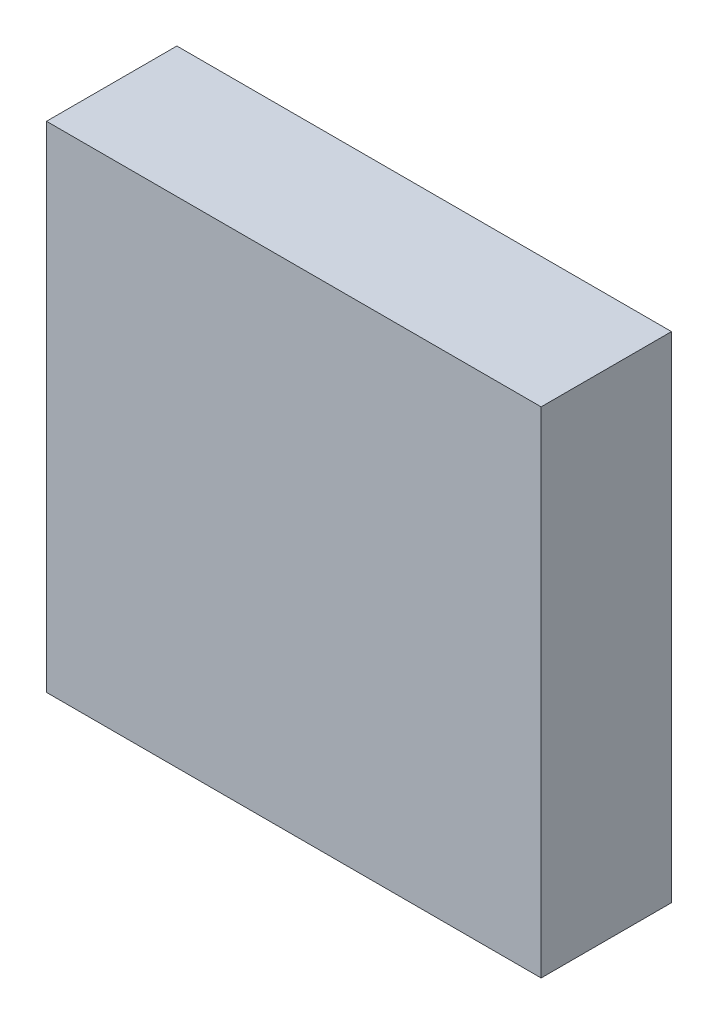
ISO-10303-21;
HEADER;
FILE_DESCRIPTION(('STEP AP214'),'2;1');
FILE_NAME('part.step','',(''),(''),'','','');
FILE_SCHEMA(('AUTOMOTIVE_DESIGN { 1 0 10303 214 1 1 1 1 }'));
ENDSEC;
DATA;
#1=APPLICATION_CONTEXT('core data for automotive mechanical design processes');
#2=APPLICATION_PROTOCOL_DEFINITION('international standard','automotive_design',2000,#1);
#3=PRODUCT_CONTEXT('',#1,'mechanical');
#4=PRODUCT('Part','Part','',(#3));
#5=PRODUCT_RELATED_PRODUCT_CATEGORY('part','',(#4));
#6=PRODUCT_DEFINITION_FORMATION('','',#4);
#7=PRODUCT_DEFINITION_CONTEXT('part definition',#1,'design');
#8=PRODUCT_DEFINITION('design','',#6,#7);
#9=PRODUCT_DEFINITION_SHAPE('','',#8);
#10=(LENGTH_UNIT() NAMED_UNIT(*) SI_UNIT(.MILLI.,.METRE.));
#11=(NAMED_UNIT(*) PLANE_ANGLE_UNIT() SI_UNIT($,.RADIAN.));
#12=(NAMED_UNIT(*) SI_UNIT($,.STERADIAN.) SOLID_ANGLE_UNIT());
#13=UNCERTAINTY_MEASURE_WITH_UNIT(LENGTH_MEASURE(1.E-05),#10,'distance_accuracy_value','');
#14=(GEOMETRIC_REPRESENTATION_CONTEXT(3) GLOBAL_UNCERTAINTY_ASSIGNED_CONTEXT((#13)) GLOBAL_UNIT_ASSIGNED_CONTEXT((#10,
#11,#12)) REPRESENTATION_CONTEXT('',''));
#15=CARTESIAN_POINT('',(0.,0.,0.));
#16=DIRECTION('',(0.,0.,1.));
#17=DIRECTION('',(1.,0.,0.));
#18=AXIS2_PLACEMENT_3D('',#15,#16,#17);
#19=CARTESIAN_POINT('',(0.,0.,1.));
#20=DIRECTION('',(0.,0.,1.));
#21=DIRECTION('',(1.,0.,0.));
#22=AXIS2_PLACEMENT_3D('',#19,#20,#21);
#23=PLANE('',#22);
#24=DIRECTION('',(1.,0.,0.));
#25=VECTOR('',#24,1.);
#26=CARTESIAN_POINT('',(3.7941,3.7941,1.));
#27=LINE('',#26,#25);
#28=CARTESIAN_POINT('',(0.,3.7941,1.));
#29=VERTEX_POINT('',#28);
#30=CARTESIAN_POINT('',(3.7941,3.7941,1.));
#31=VERTEX_POINT('',#30);
#32=EDGE_CURVE('E68',#29,#31,#27,.T.);
#33=ORIENTED_EDGE('',*,*,#32,.F.);
#34=DIRECTION('',(0.,1.,0.));
#35=VECTOR('',#34,1.);
#36=CARTESIAN_POINT('',(0.,3.7941,1.));
#37=LINE('',#36,#35);
#38=CARTESIAN_POINT('',(0.,0.,1.));
#39=VERTEX_POINT('',#38);
#40=EDGE_CURVE('E20',#39,#29,#37,.T.);
#41=ORIENTED_EDGE('',*,*,#40,.F.);
#42=DIRECTION('',(1.,0.,0.));
#43=VECTOR('',#42,1.);
#44=CARTESIAN_POINT('',(0.,0.,1.));
#45=LINE('',#44,#43);
#46=CARTESIAN_POINT('',(3.7941,0.,1.));
#47=VERTEX_POINT('',#46);
#48=EDGE_CURVE('E58',#47,#39,#45,.F.);
#49=ORIENTED_EDGE('',*,*,#48,.F.);
#50=DIRECTION('',(0.,1.,0.));
#51=VECTOR('',#50,1.);
#52=CARTESIAN_POINT('',(3.7941,0.,1.));
#53=LINE('',#52,#51);
#54=EDGE_CURVE('E53',#31,#47,#53,.F.);
#55=ORIENTED_EDGE('',*,*,#54,.F.);
#56=EDGE_LOOP('',(#33,#41,#49,#55));
#57=FACE_BOUND('',#56,.T.);
#58=ADVANCED_FACE('F17',(#57),#23,.T.);
#59=CARTESIAN_POINT('',(0.,3.7941,0.));
#60=DIRECTION('',(-1.,0.,0.));
#61=DIRECTION('',(0.,0.,1.));
#62=AXIS2_PLACEMENT_3D('',#59,#60,#61);
#63=PLANE('',#62);
#64=DIRECTION('',(0.,0.,1.));
#65=VECTOR('',#64,1.);
#66=CARTESIAN_POINT('',(0.,3.7941,0.));
#67=LINE('',#66,#65);
#68=CARTESIAN_POINT('',(0.,3.7941,0.));
#69=VERTEX_POINT('',#68);
#70=EDGE_CURVE('E79',#69,#29,#67,.T.);
#71=ORIENTED_EDGE('',*,*,#70,.F.);
#72=DIRECTION('',(0.,1.,0.));
#73=VECTOR('',#72,1.);
#74=CARTESIAN_POINT('',(0.,0.,0.));
#75=LINE('',#74,#73);
#76=CARTESIAN_POINT('',(0.,0.,0.));
#77=VERTEX_POINT('',#76);
#78=EDGE_CURVE('E74',#69,#77,#75,.F.);
#79=ORIENTED_EDGE('',*,*,#78,.T.);
#80=DIRECTION('',(0.,0.,-1.));
#81=VECTOR('',#80,1.);
#82=CARTESIAN_POINT('',(0.,0.,0.));
#83=LINE('',#82,#81);
#84=EDGE_CURVE('E63',#39,#77,#83,.T.);
#85=ORIENTED_EDGE('',*,*,#84,.F.);
#86=ORIENTED_EDGE('',*,*,#40,.T.);
#87=EDGE_LOOP('',(#71,#79,#85,#86));
#88=FACE_BOUND('',#87,.T.);
#89=ADVANCED_FACE('F73',(#88),#63,.T.);
#90=CARTESIAN_POINT('',(0.,0.,0.));
#91=DIRECTION('',(0.,-1.,0.));
#92=DIRECTION('',(0.,0.,-1.));
#93=AXIS2_PLACEMENT_3D('',#90,#91,#92);
#94=PLANE('',#93);
#95=ORIENTED_EDGE('',*,*,#84,.T.);
#96=DIRECTION('',(1.,0.,0.));
#97=VECTOR('',#96,1.);
#98=CARTESIAN_POINT('',(0.,0.,0.));
#99=LINE('',#98,#97);
#100=CARTESIAN_POINT('',(3.7941,0.,0.));
#101=VERTEX_POINT('',#100);
#102=EDGE_CURVE('E84',#77,#101,#99,.T.);
#103=ORIENTED_EDGE('',*,*,#102,.T.);
#104=DIRECTION('',(0.,0.,-1.));
#105=VECTOR('',#104,1.);
#106=CARTESIAN_POINT('',(3.7941,0.,0.));
#107=LINE('',#106,#105);
#108=EDGE_CURVE('E65',#47,#101,#107,.T.);
#109=ORIENTED_EDGE('',*,*,#108,.F.);
#110=ORIENTED_EDGE('',*,*,#48,.T.);
#111=EDGE_LOOP('',(#95,#103,#109,#110));
#112=FACE_BOUND('',#111,.T.);
#113=ADVANCED_FACE('F60',(#112),#94,.T.);
#114=CARTESIAN_POINT('',(3.7941,0.,0.));
#115=DIRECTION('',(1.,0.,0.));
#116=DIRECTION('',(0.,0.,-1.));
#117=AXIS2_PLACEMENT_3D('',#114,#115,#116);
#118=PLANE('',#117);
#119=ORIENTED_EDGE('',*,*,#108,.T.);
#120=DIRECTION('',(0.,1.,0.));
#121=VECTOR('',#120,1.);
#122=CARTESIAN_POINT('',(3.7941,0.,0.));
#123=LINE('',#122,#121);
#124=CARTESIAN_POINT('',(3.7941,3.7941,0.));
#125=VERTEX_POINT('',#124);
#126=EDGE_CURVE('E26',#101,#125,#123,.T.);
#127=ORIENTED_EDGE('',*,*,#126,.T.);
#128=DIRECTION('',(0.,0.,1.));
#129=VECTOR('',#128,1.);
#130=CARTESIAN_POINT('',(3.7941,3.7941,0.));
#131=LINE('',#130,#129);
#132=EDGE_CURVE('E34',#31,#125,#131,.F.);
#133=ORIENTED_EDGE('',*,*,#132,.F.);
#134=ORIENTED_EDGE('',*,*,#54,.T.);
#135=EDGE_LOOP('',(#119,#127,#133,#134));
#136=FACE_BOUND('',#135,.T.);
#137=ADVANCED_FACE('F88',(#136),#118,.T.);
#138=CARTESIAN_POINT('',(3.7941,3.7941,0.));
#139=DIRECTION('',(0.,1.,0.));
#140=DIRECTION('',(0.,0.,1.));
#141=AXIS2_PLACEMENT_3D('',#138,#139,#140);
#142=PLANE('',#141);
#143=ORIENTED_EDGE('',*,*,#132,.T.);
#144=DIRECTION('',(1.,0.,0.));
#145=VECTOR('',#144,1.);
#146=CARTESIAN_POINT('',(0.,3.7941,0.));
#147=LINE('',#146,#145);
#148=EDGE_CURVE('E11',#125,#69,#147,.F.);
#149=ORIENTED_EDGE('',*,*,#148,.T.);
#150=ORIENTED_EDGE('',*,*,#70,.T.);
#151=ORIENTED_EDGE('',*,*,#32,.T.);
#152=EDGE_LOOP('',(#143,#149,#150,#151));
#153=FACE_BOUND('',#152,.T.);
#154=ADVANCED_FACE('F91',(#153),#142,.T.);
#155=CARTESIAN_POINT('',(0.,0.,0.));
#156=DIRECTION('',(0.,0.,1.));
#157=DIRECTION('',(1.,0.,0.));
#158=AXIS2_PLACEMENT_3D('',#155,#156,#157);
#159=PLANE('',#158);
#160=ORIENTED_EDGE('',*,*,#126,.F.);
#161=ORIENTED_EDGE('',*,*,#102,.F.);
#162=ORIENTED_EDGE('',*,*,#78,.F.);
#163=ORIENTED_EDGE('',*,*,#148,.F.);
#164=EDGE_LOOP('',(#160,#161,#162,#163));
#165=FACE_BOUND('',#164,.T.);
#166=ADVANCED_FACE('F90',(#165),#159,.F.);
#167=CLOSED_SHELL('',(#58,#89,#113,#137,#154,#166));
#168=MANIFOLD_SOLID_BREP('B1',#167);
#169=ADVANCED_BREP_SHAPE_REPRESENTATION('',(#18,#168),#14);
#170=SHAPE_DEFINITION_REPRESENTATION(#9,#169);
ENDSEC;
END-ISO-10303-21;
